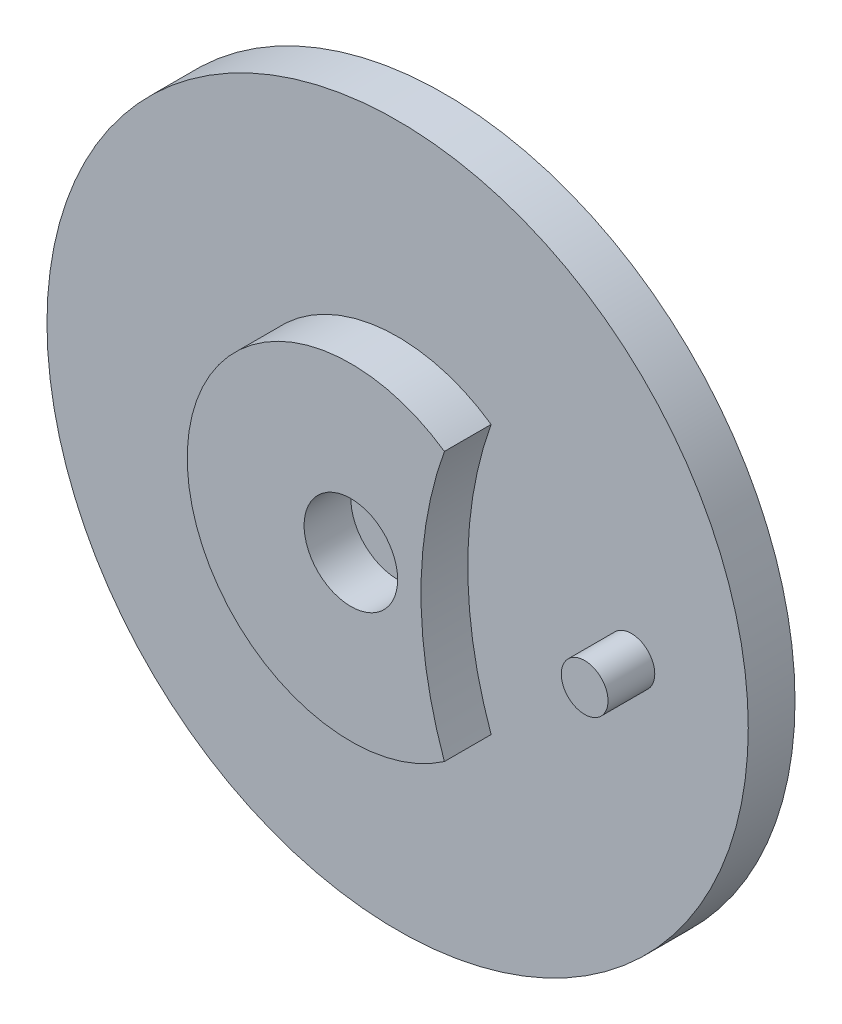
ISO-10303-21;
HEADER;
FILE_DESCRIPTION(('STEP AP214'),'2;1');
FILE_NAME('part.step','',(''),(''),'','','');
FILE_SCHEMA(('AUTOMOTIVE_DESIGN { 1 0 10303 214 1 1 1 1 }'));
ENDSEC;
DATA;
#1=APPLICATION_CONTEXT('core data for automotive mechanical design processes');
#2=APPLICATION_PROTOCOL_DEFINITION('international standard','automotive_design',2000,#1);
#3=PRODUCT_CONTEXT('',#1,'mechanical');
#4=PRODUCT('Part','Part','',(#3));
#5=PRODUCT_RELATED_PRODUCT_CATEGORY('part','',(#4));
#6=PRODUCT_DEFINITION_FORMATION('','',#4);
#7=PRODUCT_DEFINITION_CONTEXT('part definition',#1,'design');
#8=PRODUCT_DEFINITION('design','',#6,#7);
#9=PRODUCT_DEFINITION_SHAPE('','',#8);
#10=(LENGTH_UNIT() NAMED_UNIT(*) SI_UNIT(.MILLI.,.METRE.));
#11=(NAMED_UNIT(*) PLANE_ANGLE_UNIT() SI_UNIT($,.RADIAN.));
#12=(NAMED_UNIT(*) SI_UNIT($,.STERADIAN.) SOLID_ANGLE_UNIT());
#13=UNCERTAINTY_MEASURE_WITH_UNIT(LENGTH_MEASURE(1.E-05),#10,'distance_accuracy_value','');
#14=(GEOMETRIC_REPRESENTATION_CONTEXT(3) GLOBAL_UNCERTAINTY_ASSIGNED_CONTEXT((#13)) GLOBAL_UNIT_ASSIGNED_CONTEXT((#10,
#11,#12)) REPRESENTATION_CONTEXT('',''));
#15=CARTESIAN_POINT('',(0.,0.,0.));
#16=DIRECTION('',(0.,0.,1.));
#17=DIRECTION('',(1.,0.,0.));
#18=AXIS2_PLACEMENT_3D('',#15,#16,#17);
#19=CARTESIAN_POINT('',(0.,0.,10.));
#20=DIRECTION('',(0.,0.,1.));
#21=DIRECTION('',(1.,0.,0.));
#22=AXIS2_PLACEMENT_3D('',#19,#20,#21);
#23=PLANE('',#22);
#24=CARTESIAN_POINT('',(0.,0.,10.));
#25=DIRECTION('',(0.,0.,1.));
#26=DIRECTION('',(1.,0.,0.));
#27=AXIS2_PLACEMENT_3D('',#24,#25,#26);
#28=CIRCLE('',#27,75.);
#29=CARTESIAN_POINT('',(75.,0.,10.));
#30=VERTEX_POINT('',#29);
#31=EDGE_CURVE('E77',#30,#30,#28,.T.);
#32=ORIENTED_EDGE('',*,*,#31,.T.);
#33=EDGE_LOOP('',(#32));
#34=FACE_BOUND('',#33,.T.);
#35=CARTESIAN_POINT('',(0.,0.,10.));
#36=DIRECTION('',(0.,0.,1.));
#37=DIRECTION('',(1.,0.,0.));
#38=AXIS2_PLACEMENT_3D('',#35,#36,#37);
#39=CIRCLE('',#38,35.);
#40=CARTESIAN_POINT('',(20.,28.7228132326901,10.));
#41=VERTEX_POINT('',#40);
#42=CARTESIAN_POINT('',(20.,-28.7228132326902,10.));
#43=VERTEX_POINT('',#42);
#44=EDGE_CURVE('E74',#41,#43,#39,.T.);
#45=ORIENTED_EDGE('',*,*,#44,.F.);
#46=CARTESIAN_POINT('',(100.,0.,10.));
#47=DIRECTION('',(0.,0.,1.));
#48=DIRECTION('',(1.,0.,0.));
#49=AXIS2_PLACEMENT_3D('',#46,#47,#48);
#50=CIRCLE('',#49,85.);
#51=EDGE_CURVE('E47',#41,#43,#50,.T.);
#52=ORIENTED_EDGE('',*,*,#51,.T.);
#53=EDGE_LOOP('',(#45,#52));
#54=FACE_BOUND('',#53,.T.);
#55=CARTESIAN_POINT('',(50.,0.,10.));
#56=DIRECTION('',(0.,0.,1.));
#57=DIRECTION('',(1.,0.,0.));
#58=AXIS2_PLACEMENT_3D('',#55,#56,#57);
#59=CIRCLE('',#58,5.);
#60=CARTESIAN_POINT('',(55.,0.,10.));
#61=VERTEX_POINT('',#60);
#62=EDGE_CURVE('E80',#61,#61,#59,.T.);
#63=ORIENTED_EDGE('',*,*,#62,.F.);
#64=EDGE_LOOP('',(#63));
#65=FACE_BOUND('',#64,.T.);
#66=ADVANCED_FACE('F33',(#34,#54,#65),#23,.T.);
#67=CARTESIAN_POINT('',(0.,0.,20.));
#68=DIRECTION('',(0.,0.,1.));
#69=DIRECTION('',(1.,0.,0.));
#70=AXIS2_PLACEMENT_3D('',#67,#68,#69);
#71=PLANE('',#70);
#72=CARTESIAN_POINT('',(100.,0.,20.));
#73=DIRECTION('',(0.,0.,1.));
#74=DIRECTION('',(1.,0.,0.));
#75=AXIS2_PLACEMENT_3D('',#72,#73,#74);
#76=CIRCLE('',#75,85.);
#77=CARTESIAN_POINT('',(20.,28.7228132326901,20.));
#78=VERTEX_POINT('',#77);
#79=CARTESIAN_POINT('',(20.,-28.7228132326901,20.));
#80=VERTEX_POINT('',#79);
#81=EDGE_CURVE('E60',#78,#80,#76,.T.);
#82=ORIENTED_EDGE('',*,*,#81,.F.);
#83=CARTESIAN_POINT('',(0.,0.,20.));
#84=DIRECTION('',(0.,0.,1.));
#85=DIRECTION('',(1.,0.,0.));
#86=AXIS2_PLACEMENT_3D('',#83,#84,#85);
#87=CIRCLE('',#86,35.);
#88=EDGE_CURVE('E71',#78,#80,#87,.T.);
#89=ORIENTED_EDGE('',*,*,#88,.T.);
#90=EDGE_LOOP('',(#82,#89));
#91=FACE_BOUND('',#90,.T.);
#92=CARTESIAN_POINT('',(0.,0.,20.));
#93=DIRECTION('',(0.,0.,1.));
#94=DIRECTION('',(1.,0.,0.));
#95=AXIS2_PLACEMENT_3D('',#92,#93,#94);
#96=CIRCLE('',#95,10.);
#97=CARTESIAN_POINT('',(10.,0.,20.));
#98=VERTEX_POINT('',#97);
#99=EDGE_CURVE('E86',#98,#98,#96,.T.);
#100=ORIENTED_EDGE('',*,*,#99,.F.);
#101=EDGE_LOOP('',(#100));
#102=FACE_BOUND('',#101,.T.);
#103=ADVANCED_FACE('F69',(#91,#102),#71,.T.);
#104=CARTESIAN_POINT('',(0.,0.,10.));
#105=DIRECTION('',(0.,0.,1.));
#106=DIRECTION('',(1.,0.,0.));
#107=AXIS2_PLACEMENT_3D('',#104,#105,#106);
#108=CYLINDRICAL_SURFACE('',#107,10.);
#109=CARTESIAN_POINT('',(0.,0.,10.));
#110=DIRECTION('',(0.,0.,1.));
#111=DIRECTION('',(1.,0.,0.));
#112=AXIS2_PLACEMENT_3D('',#109,#110,#111);
#113=CIRCLE('',#112,10.);
#114=CARTESIAN_POINT('',(10.,0.,10.));
#115=VERTEX_POINT('',#114);
#116=EDGE_CURVE('E41',#115,#115,#113,.T.);
#117=ORIENTED_EDGE('',*,*,#116,.F.);
#118=EDGE_LOOP('',(#117));
#119=FACE_BOUND('',#118,.T.);
#120=ORIENTED_EDGE('',*,*,#99,.T.);
#121=EDGE_LOOP('',(#120));
#122=FACE_BOUND('',#121,.T.);
#123=ADVANCED_FACE('F91',(#119,#122),#108,.F.);
#124=CARTESIAN_POINT('',(0.,0.,10.));
#125=DIRECTION('',(0.,0.,1.));
#126=DIRECTION('',(1.,0.,0.));
#127=AXIS2_PLACEMENT_3D('',#124,#125,#126);
#128=PLANE('',#127);
#129=ORIENTED_EDGE('',*,*,#116,.T.);
#130=EDGE_LOOP('',(#129));
#131=FACE_BOUND('',#130,.T.);
#132=ADVANCED_FACE('F98',(#131),#128,.T.);
#133=CARTESIAN_POINT('',(0.,0.,10.));
#134=DIRECTION('',(0.,0.,1.));
#135=DIRECTION('',(1.,0.,0.));
#136=AXIS2_PLACEMENT_3D('',#133,#134,#135);
#137=CYLINDRICAL_SURFACE('',#136,35.);
#138=DIRECTION('',(0.,0.,1.));
#139=VECTOR('',#138,1.);
#140=CARTESIAN_POINT('',(20.,28.7228132326901,10.));
#141=LINE('',#140,#139);
#142=EDGE_CURVE('E57',#41,#78,#141,.T.);
#143=ORIENTED_EDGE('',*,*,#142,.F.);
#144=ORIENTED_EDGE('',*,*,#44,.T.);
#145=DIRECTION('',(0.,0.,1.));
#146=VECTOR('',#145,1.);
#147=CARTESIAN_POINT('',(20.,-28.7228132326901,10.));
#148=LINE('',#147,#146);
#149=EDGE_CURVE('E65',#43,#80,#148,.T.);
#150=ORIENTED_EDGE('',*,*,#149,.T.);
#151=ORIENTED_EDGE('',*,*,#88,.F.);
#152=EDGE_LOOP('',(#143,#144,#150,#151));
#153=FACE_BOUND('',#152,.T.);
#154=ADVANCED_FACE('F73',(#153),#137,.T.);
#155=CARTESIAN_POINT('',(0.,0.,0.));
#156=DIRECTION('',(0.,0.,1.));
#157=DIRECTION('',(1.,0.,0.));
#158=AXIS2_PLACEMENT_3D('',#155,#156,#157);
#159=PLANE('',#158);
#160=CARTESIAN_POINT('',(0.,0.,0.));
#161=DIRECTION('',(0.,0.,1.));
#162=DIRECTION('',(1.,0.,0.));
#163=AXIS2_PLACEMENT_3D('',#160,#161,#162);
#164=CIRCLE('',#163,75.);
#165=CARTESIAN_POINT('',(75.,0.,0.));
#166=VERTEX_POINT('',#165);
#167=EDGE_CURVE('E11',#166,#166,#164,.T.);
#168=ORIENTED_EDGE('',*,*,#167,.F.);
#169=EDGE_LOOP('',(#168));
#170=FACE_BOUND('',#169,.T.);
#171=ADVANCED_FACE('F104',(#170),#159,.F.);
#172=CARTESIAN_POINT('',(0.,0.,20.));
#173=DIRECTION('',(0.,0.,-1.));
#174=DIRECTION('',(-1.,0.,0.));
#175=AXIS2_PLACEMENT_3D('',#172,#173,#174);
#176=CYLINDRICAL_SURFACE('',#175,75.);
#177=ORIENTED_EDGE('',*,*,#167,.T.);
#178=EDGE_LOOP('',(#177));
#179=FACE_BOUND('',#178,.T.);
#180=ORIENTED_EDGE('',*,*,#31,.F.);
#181=EDGE_LOOP('',(#180));
#182=FACE_BOUND('',#181,.T.);
#183=ADVANCED_FACE('F35',(#179,#182),#176,.T.);
#184=CARTESIAN_POINT('',(50.,0.,20.));
#185=DIRECTION('',(0.,0.,-1.));
#186=DIRECTION('',(-1.,0.,0.));
#187=AXIS2_PLACEMENT_3D('',#184,#185,#186);
#188=CYLINDRICAL_SURFACE('',#187,5.);
#189=CARTESIAN_POINT('',(50.,0.,20.));
#190=DIRECTION('',(0.,0.,1.));
#191=DIRECTION('',(1.,0.,0.));
#192=AXIS2_PLACEMENT_3D('',#189,#190,#191);
#193=CIRCLE('',#192,5.);
#194=CARTESIAN_POINT('',(55.,0.,20.));
#195=VERTEX_POINT('',#194);
#196=EDGE_CURVE('E75',#195,#195,#193,.T.);
#197=ORIENTED_EDGE('',*,*,#196,.F.);
#198=EDGE_LOOP('',(#197));
#199=FACE_BOUND('',#198,.T.);
#200=ORIENTED_EDGE('',*,*,#62,.T.);
#201=EDGE_LOOP('',(#200));
#202=FACE_BOUND('',#201,.T.);
#203=ADVANCED_FACE('F111',(#199,#202),#188,.T.);
#204=CARTESIAN_POINT('',(50.,0.,20.));
#205=DIRECTION('',(0.,0.,1.));
#206=DIRECTION('',(1.,0.,0.));
#207=AXIS2_PLACEMENT_3D('',#204,#205,#206);
#208=PLANE('',#207);
#209=ORIENTED_EDGE('',*,*,#196,.T.);
#210=EDGE_LOOP('',(#209));
#211=FACE_BOUND('',#210,.T.);
#212=ADVANCED_FACE('F124',(#211),#208,.T.);
#213=CARTESIAN_POINT('',(100.,0.,10.));
#214=DIRECTION('',(0.,0.,1.));
#215=DIRECTION('',(1.,0.,0.));
#216=AXIS2_PLACEMENT_3D('',#213,#214,#215);
#217=CYLINDRICAL_SURFACE('',#216,85.);
#218=ORIENTED_EDGE('',*,*,#81,.T.);
#219=ORIENTED_EDGE('',*,*,#149,.F.);
#220=ORIENTED_EDGE('',*,*,#51,.F.);
#221=ORIENTED_EDGE('',*,*,#142,.T.);
#222=EDGE_LOOP('',(#218,#219,#220,#221));
#223=FACE_BOUND('',#222,.T.);
#224=ADVANCED_FACE('F59',(#223),#217,.F.);
#225=CLOSED_SHELL('',(#66,#103,#123,#132,#154,#171,#183,#203,#212,#224));
#226=MANIFOLD_SOLID_BREP('B2',#225);
#227=ADVANCED_BREP_SHAPE_REPRESENTATION('',(#18,#226),#14);
#228=SHAPE_DEFINITION_REPRESENTATION(#9,#227);
ENDSEC;
END-ISO-10303-21;
